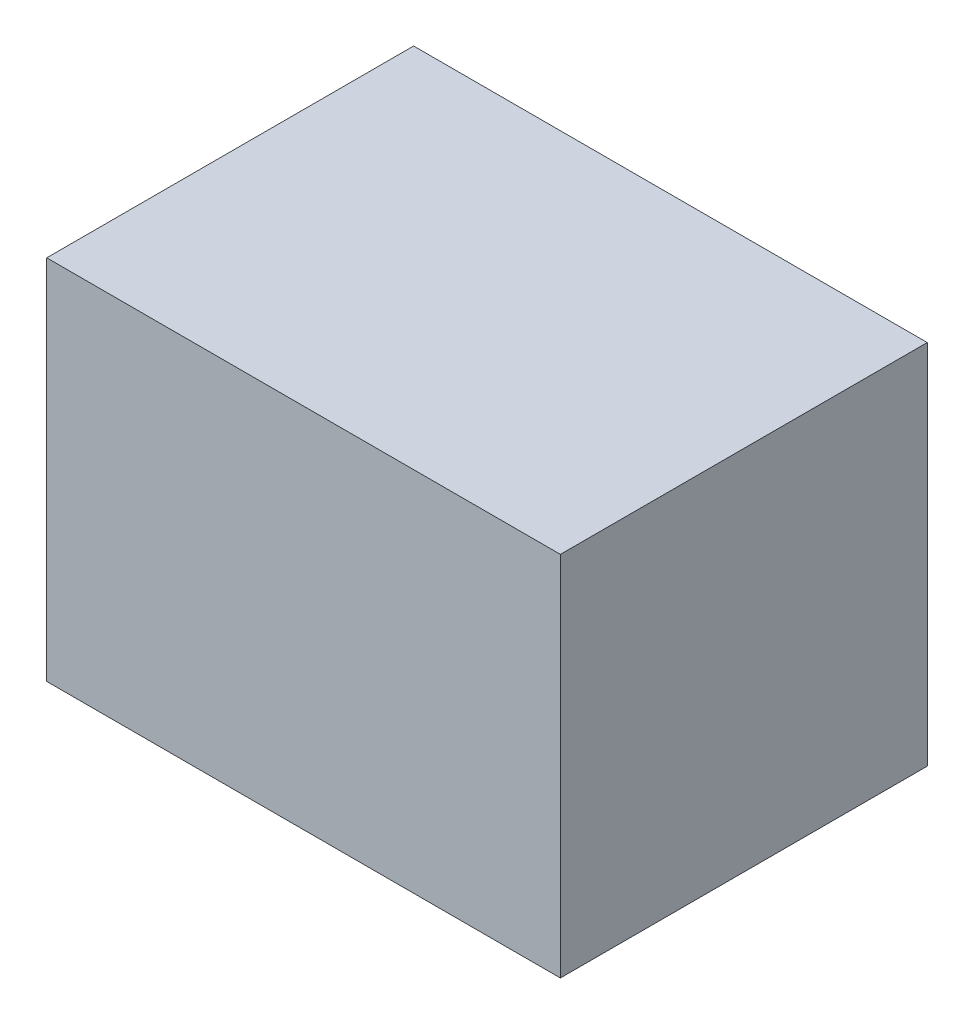
ISO-10303-21;
HEADER;
FILE_DESCRIPTION(('STEP AP214'),'2;1');
FILE_NAME('part.step','',(''),(''),'','','');
FILE_SCHEMA(('AUTOMOTIVE_DESIGN { 1 0 10303 214 1 1 1 1 }'));
ENDSEC;
DATA;
#1=APPLICATION_CONTEXT('core data for automotive mechanical design processes');
#2=APPLICATION_PROTOCOL_DEFINITION('international standard','automotive_design',2000,#1);
#3=PRODUCT_CONTEXT('',#1,'mechanical');
#4=PRODUCT('Part','Part','',(#3));
#5=PRODUCT_RELATED_PRODUCT_CATEGORY('part','',(#4));
#6=PRODUCT_DEFINITION_FORMATION('','',#4);
#7=PRODUCT_DEFINITION_CONTEXT('part definition',#1,'design');
#8=PRODUCT_DEFINITION('design','',#6,#7);
#9=PRODUCT_DEFINITION_SHAPE('','',#8);
#10=(LENGTH_UNIT() NAMED_UNIT(*) SI_UNIT(.MILLI.,.METRE.));
#11=(NAMED_UNIT(*) PLANE_ANGLE_UNIT() SI_UNIT($,.RADIAN.));
#12=(NAMED_UNIT(*) SI_UNIT($,.STERADIAN.) SOLID_ANGLE_UNIT());
#13=UNCERTAINTY_MEASURE_WITH_UNIT(LENGTH_MEASURE(1.E-05),#10,'distance_accuracy_value','');
#14=(GEOMETRIC_REPRESENTATION_CONTEXT(3) GLOBAL_UNCERTAINTY_ASSIGNED_CONTEXT((#13)) GLOBAL_UNIT_ASSIGNED_CONTEXT((#10,
#11,#12)) REPRESENTATION_CONTEXT('',''));
#15=CARTESIAN_POINT('',(0.,0.,0.));
#16=DIRECTION('',(0.,0.,1.));
#17=DIRECTION('',(1.,0.,0.));
#18=AXIS2_PLACEMENT_3D('',#15,#16,#17);
#19=CARTESIAN_POINT('',(0.,-31.75,-31.75));
#20=DIRECTION('',(1.,0.,0.));
#21=DIRECTION('',(0.,0.,-1.));
#22=AXIS2_PLACEMENT_3D('',#19,#20,#21);
#23=PLANE('',#22);
#24=DIRECTION('',(0.,1.,0.));
#25=VECTOR('',#24,1.);
#26=CARTESIAN_POINT('',(0.,31.75,-31.75));
#27=LINE('',#26,#25);
#28=CARTESIAN_POINT('',(0.,-31.75,-31.75));
#29=VERTEX_POINT('',#28);
#30=CARTESIAN_POINT('',(0.,31.75,-31.75));
#31=VERTEX_POINT('',#30);
#32=EDGE_CURVE('E100',#29,#31,#27,.T.);
#33=ORIENTED_EDGE('',*,*,#32,.F.);
#34=DIRECTION('',(0.,0.,-1.));
#35=VECTOR('',#34,1.);
#36=CARTESIAN_POINT('',(0.,-31.75,31.75));
#37=LINE('',#36,#35);
#38=CARTESIAN_POINT('',(0.,-31.75,31.75));
#39=VERTEX_POINT('',#38);
#40=EDGE_CURVE('E73',#39,#29,#37,.T.);
#41=ORIENTED_EDGE('',*,*,#40,.F.);
#42=DIRECTION('',(0.,-1.,0.));
#43=VECTOR('',#42,1.);
#44=CARTESIAN_POINT('',(0.,31.75,31.75));
#45=LINE('',#44,#43);
#46=CARTESIAN_POINT('',(0.,31.75,31.75));
#47=VERTEX_POINT('',#46);
#48=EDGE_CURVE('E67',#47,#39,#45,.T.);
#49=ORIENTED_EDGE('',*,*,#48,.F.);
#50=DIRECTION('',(0.,0.,1.));
#51=VECTOR('',#50,1.);
#52=CARTESIAN_POINT('',(0.,31.75,31.75));
#53=LINE('',#52,#51);
#54=EDGE_CURVE('E91',#31,#47,#53,.T.);
#55=ORIENTED_EDGE('',*,*,#54,.F.);
#56=EDGE_LOOP('',(#33,#41,#49,#55));
#57=FACE_BOUND('',#56,.T.);
#58=CARTESIAN_POINT('',(0.,0.,0.));
#59=DIRECTION('',(1.,0.,0.));
#60=DIRECTION('',(0.,0.,-1.));
#61=AXIS2_PLACEMENT_3D('',#58,#59,#60);
#62=CIRCLE('',#61,3.);
#63=CARTESIAN_POINT('',(0.,0.,-3.));
#64=VERTEX_POINT('',#63);
#65=EDGE_CURVE('E11',#64,#64,#62,.F.);
#66=ORIENTED_EDGE('',*,*,#65,.F.);
#67=EDGE_LOOP('',(#66));
#68=FACE_BOUND('',#67,.T.);
#69=ADVANCED_FACE('F33',(#57,#68),#23,.F.);
#70=CARTESIAN_POINT('',(88.9,31.75,-31.75));
#71=DIRECTION('',(0.,0.,1.));
#72=DIRECTION('',(0.,-1.,0.));
#73=AXIS2_PLACEMENT_3D('',#70,#71,#72);
#74=PLANE('',#73);
#75=ORIENTED_EDGE('',*,*,#32,.T.);
#76=DIRECTION('',(-1.,0.,0.));
#77=VECTOR('',#76,1.);
#78=CARTESIAN_POINT('',(88.9,31.75,-31.75));
#79=LINE('',#78,#77);
#80=CARTESIAN_POINT('',(88.9,31.75,-31.75));
#81=VERTEX_POINT('',#80);
#82=EDGE_CURVE('E42',#81,#31,#79,.T.);
#83=ORIENTED_EDGE('',*,*,#82,.F.);
#84=DIRECTION('',(0.,1.,0.));
#85=VECTOR('',#84,1.);
#86=CARTESIAN_POINT('',(88.9,31.75,-31.75));
#87=LINE('',#86,#85);
#88=CARTESIAN_POINT('',(88.9,-31.75,-31.75));
#89=VERTEX_POINT('',#88);
#90=EDGE_CURVE('E86',#89,#81,#87,.T.);
#91=ORIENTED_EDGE('',*,*,#90,.F.);
#92=DIRECTION('',(-1.,0.,0.));
#93=VECTOR('',#92,1.);
#94=CARTESIAN_POINT('',(88.9,-31.75,-31.75));
#95=LINE('',#94,#93);
#96=EDGE_CURVE('E96',#89,#29,#95,.T.);
#97=ORIENTED_EDGE('',*,*,#96,.T.);
#98=EDGE_LOOP('',(#75,#83,#91,#97));
#99=FACE_BOUND('',#98,.T.);
#100=ADVANCED_FACE('F35',(#99),#74,.F.);
#101=CARTESIAN_POINT('',(88.9,31.75,31.75));
#102=DIRECTION('',(0.,-1.,0.));
#103=DIRECTION('',(0.,0.,-1.));
#104=AXIS2_PLACEMENT_3D('',#101,#102,#103);
#105=PLANE('',#104);
#106=ORIENTED_EDGE('',*,*,#54,.T.);
#107=DIRECTION('',(-1.,0.,0.));
#108=VECTOR('',#107,1.);
#109=CARTESIAN_POINT('',(88.9,31.75,31.75));
#110=LINE('',#109,#108);
#111=CARTESIAN_POINT('',(88.9,31.75,31.75));
#112=VERTEX_POINT('',#111);
#113=EDGE_CURVE('E89',#112,#47,#110,.T.);
#114=ORIENTED_EDGE('',*,*,#113,.F.);
#115=DIRECTION('',(0.,0.,1.));
#116=VECTOR('',#115,1.);
#117=CARTESIAN_POINT('',(88.9,31.75,31.75));
#118=LINE('',#117,#116);
#119=EDGE_CURVE('E81',#81,#112,#118,.T.);
#120=ORIENTED_EDGE('',*,*,#119,.F.);
#121=ORIENTED_EDGE('',*,*,#82,.T.);
#122=EDGE_LOOP('',(#106,#114,#120,#121));
#123=FACE_BOUND('',#122,.T.);
#124=ADVANCED_FACE('F90',(#123),#105,.F.);
#125=CARTESIAN_POINT('',(88.9,31.75,31.75));
#126=DIRECTION('',(0.,0.,-1.));
#127=DIRECTION('',(0.,1.,0.));
#128=AXIS2_PLACEMENT_3D('',#125,#126,#127);
#129=PLANE('',#128);
#130=ORIENTED_EDGE('',*,*,#48,.T.);
#131=DIRECTION('',(-1.,0.,0.));
#132=VECTOR('',#131,1.);
#133=CARTESIAN_POINT('',(88.9,-31.75,31.75));
#134=LINE('',#133,#132);
#135=CARTESIAN_POINT('',(88.9,-31.75,31.75));
#136=VERTEX_POINT('',#135);
#137=EDGE_CURVE('E92',#136,#39,#134,.T.);
#138=ORIENTED_EDGE('',*,*,#137,.F.);
#139=DIRECTION('',(0.,-1.,0.));
#140=VECTOR('',#139,1.);
#141=CARTESIAN_POINT('',(88.9,31.75,31.75));
#142=LINE('',#141,#140);
#143=EDGE_CURVE('E84',#112,#136,#142,.T.);
#144=ORIENTED_EDGE('',*,*,#143,.F.);
#145=ORIENTED_EDGE('',*,*,#113,.T.);
#146=EDGE_LOOP('',(#130,#138,#144,#145));
#147=FACE_BOUND('',#146,.T.);
#148=ADVANCED_FACE('F94',(#147),#129,.F.);
#149=CARTESIAN_POINT('',(88.9,-31.75,31.75));
#150=DIRECTION('',(0.,1.,0.));
#151=DIRECTION('',(0.,0.,1.));
#152=AXIS2_PLACEMENT_3D('',#149,#150,#151);
#153=PLANE('',#152);
#154=ORIENTED_EDGE('',*,*,#40,.T.);
#155=ORIENTED_EDGE('',*,*,#96,.F.);
#156=DIRECTION('',(0.,0.,-1.));
#157=VECTOR('',#156,1.);
#158=CARTESIAN_POINT('',(88.9,-31.75,31.75));
#159=LINE('',#158,#157);
#160=EDGE_CURVE('E50',#136,#89,#159,.T.);
#161=ORIENTED_EDGE('',*,*,#160,.F.);
#162=ORIENTED_EDGE('',*,*,#137,.T.);
#163=EDGE_LOOP('',(#154,#155,#161,#162));
#164=FACE_BOUND('',#163,.T.);
#165=ADVANCED_FACE('F127',(#164),#153,.F.);
#166=CARTESIAN_POINT('',(88.9,-31.75,-31.75));
#167=DIRECTION('',(1.,0.,0.));
#168=DIRECTION('',(0.,0.,-1.));
#169=AXIS2_PLACEMENT_3D('',#166,#167,#168);
#170=PLANE('',#169);
#171=ORIENTED_EDGE('',*,*,#90,.T.);
#172=ORIENTED_EDGE('',*,*,#119,.T.);
#173=ORIENTED_EDGE('',*,*,#143,.T.);
#174=ORIENTED_EDGE('',*,*,#160,.T.);
#175=EDGE_LOOP('',(#171,#172,#173,#174));
#176=FACE_BOUND('',#175,.T.);
#177=ADVANCED_FACE('F82',(#176),#170,.T.);
#178=CARTESIAN_POINT('',(-22.225,0.,0.));
#179=DIRECTION('',(1.,0.,0.));
#180=DIRECTION('',(0.,0.,-1.));
#181=AXIS2_PLACEMENT_3D('',#178,#179,#180);
#182=CYLINDRICAL_SURFACE('',#181,3.);
#183=CARTESIAN_POINT('',(-22.225,0.,0.));
#184=DIRECTION('',(-1.,0.,0.));
#185=DIRECTION('',(0.,0.,1.));
#186=AXIS2_PLACEMENT_3D('',#183,#184,#185);
#187=CIRCLE('',#186,3.);
#188=CARTESIAN_POINT('',(-22.225,0.,3.));
#189=VERTEX_POINT('',#188);
#190=EDGE_CURVE('E103',#189,#189,#187,.T.);
#191=ORIENTED_EDGE('',*,*,#190,.F.);
#192=EDGE_LOOP('',(#191));
#193=FACE_BOUND('',#192,.T.);
#194=ORIENTED_EDGE('',*,*,#65,.T.);
#195=EDGE_LOOP('',(#194));
#196=FACE_BOUND('',#195,.T.);
#197=ADVANCED_FACE('F116',(#193,#196),#182,.T.);
#198=CARTESIAN_POINT('',(-22.225,0.,0.));
#199=DIRECTION('',(-1.,0.,0.));
#200=DIRECTION('',(0.,0.,1.));
#201=AXIS2_PLACEMENT_3D('',#198,#199,#200);
#202=PLANE('',#201);
#203=ORIENTED_EDGE('',*,*,#190,.T.);
#204=EDGE_LOOP('',(#203));
#205=FACE_BOUND('',#204,.T.);
#206=ADVANCED_FACE('F118',(#205),#202,.T.);
#207=CLOSED_SHELL('',(#69,#100,#124,#148,#165,#177,#197,#206));
#208=MANIFOLD_SOLID_BREP('B2',#207);
#209=ADVANCED_BREP_SHAPE_REPRESENTATION('',(#18,#208),#14);
#210=SHAPE_DEFINITION_REPRESENTATION(#9,#209);
ENDSEC;
END-ISO-10303-21;
